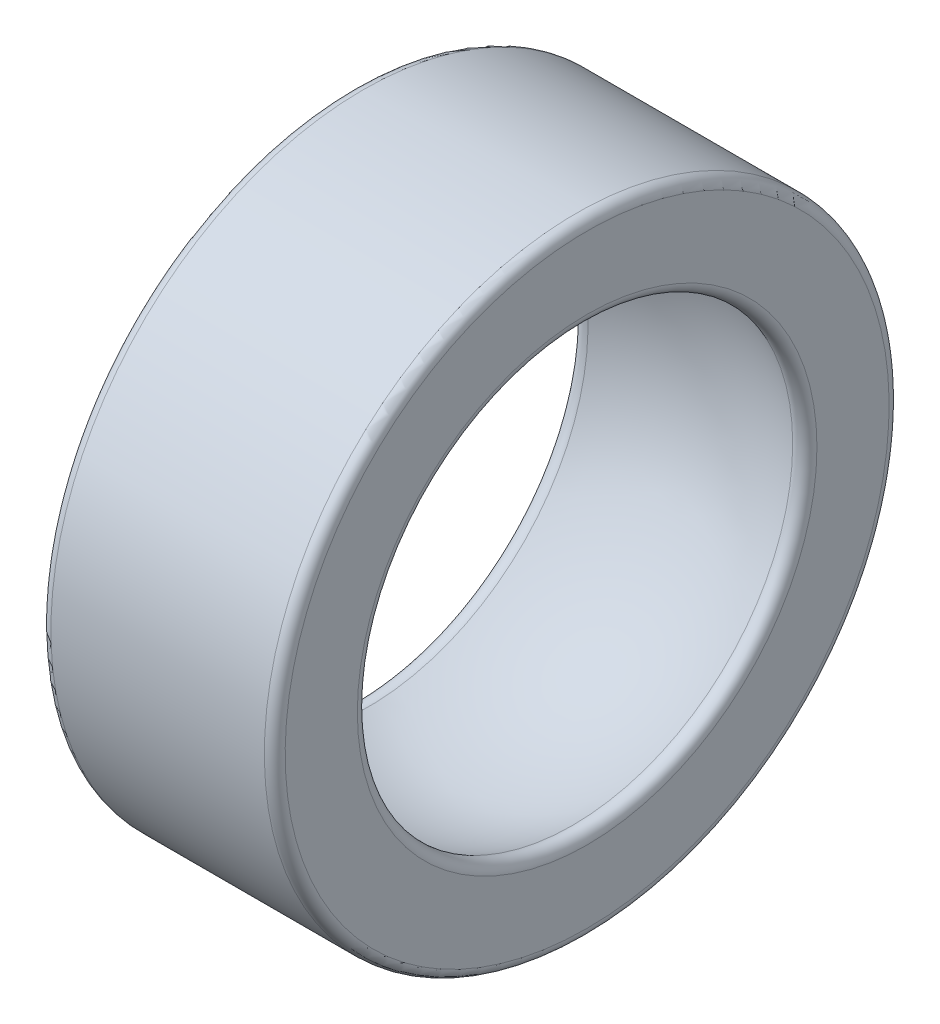
ISO-10303-21;
HEADER;
FILE_DESCRIPTION(('STEP AP214'),'2;1');
FILE_NAME('part.step','',(''),(''),'','','');
FILE_SCHEMA(('AUTOMOTIVE_DESIGN { 1 0 10303 214 1 1 1 1 }'));
ENDSEC;
DATA;
#1=APPLICATION_CONTEXT('core data for automotive mechanical design processes');
#2=APPLICATION_PROTOCOL_DEFINITION('international standard','automotive_design',2000,#1);
#3=PRODUCT_CONTEXT('',#1,'mechanical');
#4=PRODUCT('Part','Part','',(#3));
#5=PRODUCT_RELATED_PRODUCT_CATEGORY('part','',(#4));
#6=PRODUCT_DEFINITION_FORMATION('','',#4);
#7=PRODUCT_DEFINITION_CONTEXT('part definition',#1,'design');
#8=PRODUCT_DEFINITION('design','',#6,#7);
#9=PRODUCT_DEFINITION_SHAPE('','',#8);
#10=(LENGTH_UNIT() NAMED_UNIT(*) SI_UNIT(.MILLI.,.METRE.));
#11=(NAMED_UNIT(*) PLANE_ANGLE_UNIT() SI_UNIT($,.RADIAN.));
#12=(NAMED_UNIT(*) SI_UNIT($,.STERADIAN.) SOLID_ANGLE_UNIT());
#13=UNCERTAINTY_MEASURE_WITH_UNIT(LENGTH_MEASURE(1.E-05),#10,'distance_accuracy_value','');
#14=(GEOMETRIC_REPRESENTATION_CONTEXT(3) GLOBAL_UNCERTAINTY_ASSIGNED_CONTEXT((#13)) GLOBAL_UNIT_ASSIGNED_CONTEXT((#10,
#11,#12)) REPRESENTATION_CONTEXT('',''));
#15=CARTESIAN_POINT('',(0.,0.,0.));
#16=DIRECTION('',(0.,0.,1.));
#17=DIRECTION('',(1.,0.,0.));
#18=AXIS2_PLACEMENT_3D('',#15,#16,#17);
#19=CARTESIAN_POINT('',(3.375,6.13264828601804,0.));
#20=DIRECTION('',(-1.,0.,0.));
#21=DIRECTION('',(0.,-1.,0.));
#22=AXIS2_PLACEMENT_3D('',#19,#20,#21);
#23=PLANE('',#22);
#24=CARTESIAN_POINT('',(3.375,0.,0.));
#25=DIRECTION('',(-1.,0.,0.));
#26=DIRECTION('',(0.,-1.,0.));
#27=AXIS2_PLACEMENT_3D('',#24,#25,#26);
#28=CIRCLE('',#27,6.6207533559256);
#29=CARTESIAN_POINT('',(3.375,-6.6207533559256,0.));
#30=VERTEX_POINT('',#29);
#31=EDGE_CURVE('E44',#30,#30,#28,.T.);
#32=ORIENTED_EDGE('',*,*,#31,.T.);
#33=EDGE_LOOP('',(#32));
#34=FACE_BOUND('',#33,.T.);
#35=CARTESIAN_POINT('',(3.375,0.,0.));
#36=DIRECTION('',(-1.,0.,0.));
#37=DIRECTION('',(0.,-1.,0.));
#38=AXIS2_PLACEMENT_3D('',#35,#36,#37);
#39=CIRCLE('',#38,8.7);
#40=CARTESIAN_POINT('',(3.375,-8.7,0.));
#41=VERTEX_POINT('',#40);
#42=EDGE_CURVE('E48',#41,#41,#39,.F.);
#43=ORIENTED_EDGE('',*,*,#42,.T.);
#44=EDGE_LOOP('',(#43));
#45=FACE_BOUND('',#44,.T.);
#46=ADVANCED_FACE('F33',(#34,#45),#23,.F.);
#47=CARTESIAN_POINT('',(-8.35357055119223,0.,0.));
#48=DIRECTION('',(-1.,0.,0.));
#49=DIRECTION('',(0.,-1.,0.));
#50=AXIS2_PLACEMENT_3D('',#47,#48,#49);
#51=CYLINDRICAL_SURFACE('',#50,9.);
#52=CARTESIAN_POINT('',(3.075,0.,0.));
#53=DIRECTION('',(-1.,0.,0.));
#54=DIRECTION('',(0.,-1.,0.));
#55=AXIS2_PLACEMENT_3D('',#52,#53,#54);
#56=CIRCLE('',#55,9.);
#57=CARTESIAN_POINT('',(3.075,-9.,0.));
#58=VERTEX_POINT('',#57);
#59=EDGE_CURVE('E10',#58,#58,#56,.T.);
#60=ORIENTED_EDGE('',*,*,#59,.T.);
#61=EDGE_LOOP('',(#60));
#62=FACE_BOUND('',#61,.T.);
#63=CARTESIAN_POINT('',(-3.075,0.,0.));
#64=DIRECTION('',(1.,0.,0.));
#65=DIRECTION('',(0.,1.,0.));
#66=AXIS2_PLACEMENT_3D('',#63,#64,#65);
#67=CIRCLE('',#66,9.);
#68=CARTESIAN_POINT('',(-3.075,9.,0.));
#69=VERTEX_POINT('',#68);
#70=EDGE_CURVE('E40',#69,#69,#67,.T.);
#71=ORIENTED_EDGE('',*,*,#70,.T.);
#72=EDGE_LOOP('',(#71));
#73=FACE_BOUND('',#72,.T.);
#74=ADVANCED_FACE('F78',(#62,#73),#51,.T.);
#75=CARTESIAN_POINT('',(-3.375,6.13264828601804,0.));
#76=DIRECTION('',(1.,0.,0.));
#77=DIRECTION('',(0.,1.,0.));
#78=AXIS2_PLACEMENT_3D('',#75,#76,#77);
#79=PLANE('',#78);
#80=CARTESIAN_POINT('',(-3.375,0.,0.));
#81=DIRECTION('',(1.,0.,0.));
#82=DIRECTION('',(0.,1.,0.));
#83=AXIS2_PLACEMENT_3D('',#80,#81,#82);
#84=CIRCLE('',#83,6.62075335592559);
#85=CARTESIAN_POINT('',(-3.375,6.62075335592559,0.));
#86=VERTEX_POINT('',#85);
#87=EDGE_CURVE('E53',#86,#86,#84,.T.);
#88=ORIENTED_EDGE('',*,*,#87,.T.);
#89=EDGE_LOOP('',(#88));
#90=FACE_BOUND('',#89,.T.);
#91=CARTESIAN_POINT('',(-3.375,0.,0.));
#92=DIRECTION('',(1.,0.,0.));
#93=DIRECTION('',(0.,1.,0.));
#94=AXIS2_PLACEMENT_3D('',#91,#92,#93);
#95=CIRCLE('',#94,8.7);
#96=CARTESIAN_POINT('',(-3.375,8.7,0.));
#97=VERTEX_POINT('',#96);
#98=EDGE_CURVE('E56',#97,#97,#95,.F.);
#99=ORIENTED_EDGE('',*,*,#98,.T.);
#100=EDGE_LOOP('',(#99));
#101=FACE_BOUND('',#100,.T.);
#102=ADVANCED_FACE('F94',(#90,#101),#79,.F.);
#103=CARTESIAN_POINT('',(0.,0.,0.));
#104=DIRECTION('',(-1.,0.,0.));
#105=DIRECTION('',(0.,1.,0.));
#106=AXIS2_PLACEMENT_3D('',#103,#104,#105);
#107=SPHERICAL_SURFACE('',#106,7.);
#108=CARTESIAN_POINT('',(-2.9486301369863,0.,0.));
#109=DIRECTION('',(1.,0.,0.));
#110=DIRECTION('',(0.,1.,0.));
#111=AXIS2_PLACEMENT_3D('',#108,#109,#110);
#112=CIRCLE('',#111,6.34866760157249);
#113=CARTESIAN_POINT('',(-2.9486301369863,6.34866760157249,0.));
#114=VERTEX_POINT('',#113);
#115=EDGE_CURVE('E59',#114,#114,#112,.F.);
#116=CARTESIAN_POINT('',(2.9486301369863,0.,0.));
#117=DIRECTION('',(-1.,0.,0.));
#118=DIRECTION('',(0.,-1.,0.));
#119=AXIS2_PLACEMENT_3D('',#116,#117,#118);
#120=CIRCLE('',#119,6.34866760157249);
#121=CARTESIAN_POINT('',(2.9486301369863,6.34866760157249,0.));
#122=VERTEX_POINT('',#121);
#123=EDGE_CURVE('E62',#122,#122,#120,.F.);
#124=CARTESIAN_POINT('',(-2.9486301369863,6.34866760157249,0.));
#125=CARTESIAN_POINT('',(-2.89112131779377,6.37537774721778,0.));
#126=CARTESIAN_POINT('',(-2.83324939456579,6.40130607147659,0.));
#127=CARTESIAN_POINT('',(-2.71682247335963,6.45158085173497,0.));
#128=CARTESIAN_POINT('',(-2.65826747538146,6.47592730773454,0.));
#129=CARTESIAN_POINT('',(-2.54051753799562,6.52302012598816,0.));
#130=CARTESIAN_POINT('',(-2.48132259858796,6.54576648824221,0.));
#131=CARTESIAN_POINT('',(-2.36233651938632,6.58964238810665,0.));
#132=CARTESIAN_POINT('',(-2.30254537959235,6.61077192571704,0.));
#133=CARTESIAN_POINT('',(-2.18241104470974,6.6513985554716,0.));
#134=CARTESIAN_POINT('',(-2.1220678496211,6.67089564761578,0.));
#135=CARTESIAN_POINT('',(-2.00087396660975,6.70824299356644,0.));
#136=CARTESIAN_POINT('',(-1.94002327868704,6.72609324737294,0.));
#137=CARTESIAN_POINT('',(-1.81785934462588,6.76013373386251,0.));
#138=CARTESIAN_POINT('',(-1.75654609848742,6.77632396654558,0.));
#139=CARTESIAN_POINT('',(-1.63350232488574,6.80703245545798,0.));
#140=CARTESIAN_POINT('',(-1.57177179742252,6.8215507116873,0.));
#141=CARTESIAN_POINT('',(-1.44793904601683,6.84890452659994,0.));
#142=CARTESIAN_POINT('',(-1.38583682207438,6.86174008528325,0.));
#143=CARTESIAN_POINT('',(-1.26130653708491,6.88571902671483,0.));
#144=CARTESIAN_POINT('',(-1.1988784760379,6.89686240946309,0.));
#145=CARTESIAN_POINT('',(-1.0737426168149,6.91744877019117,0.));
#146=CARTESIAN_POINT('',(-1.01103481863891,6.92689174817098,0.));
#147=CARTESIAN_POINT('',(-0.885385791708884,6.94407032620036,0.));
#148=CARTESIAN_POINT('',(-0.822444562954847,6.95180592624992,0.));
#149=CARTESIAN_POINT('',(-0.696375153795426,6.96556403606734,0.));
#150=CARTESIAN_POINT('',(-0.633246973390042,6.9715865458352,0.));
#151=CARTESIAN_POINT('',(-0.50685027790926,6.98191402776925,0.));
#152=CARTESIAN_POINT('',(-0.443581762833862,6.98621899993545,0.));
#153=CARTESIAN_POINT('',(-0.316951118624402,6.99310822766105,0.));
#154=CARTESIAN_POINT('',(-0.25358898949034,6.99569248322046,0.));
#155=CARTESIAN_POINT('',(-0.126817906904185,6.99913836938993,0.));
#156=CARTESIAN_POINT('',(-0.0634089534520932,7.,0.));
#157=CARTESIAN_POINT('',(0.0634089534520912,7.,0.));
#158=CARTESIAN_POINT('',(0.126817906904183,6.99913836938993,0.));
#159=CARTESIAN_POINT('',(0.253588989490338,6.99569248322046,0.));
#160=CARTESIAN_POINT('',(0.3169511186244,6.99310822766105,0.));
#161=CARTESIAN_POINT('',(0.44358176283386,6.98621899993545,0.));
#162=CARTESIAN_POINT('',(0.506850277909258,6.98191402776926,0.));
#163=CARTESIAN_POINT('',(0.63324697339004,6.9715865458352,0.));
#164=CARTESIAN_POINT('',(0.696375153795424,6.96556403606734,0.));
#165=CARTESIAN_POINT('',(0.822444562954845,6.95180592624992,0.));
#166=CARTESIAN_POINT('',(0.885385791708882,6.94407032620036,0.));
#167=CARTESIAN_POINT('',(1.01103481863891,6.92689174817098,0.));
#168=CARTESIAN_POINT('',(1.0737426168149,6.91744877019117,0.));
#169=CARTESIAN_POINT('',(1.1988784760379,6.89686240946309,0.));
#170=CARTESIAN_POINT('',(1.26130653708491,6.88571902671483,0.));
#171=CARTESIAN_POINT('',(1.38583682207437,6.86174008528325,0.));
#172=CARTESIAN_POINT('',(1.44793904601683,6.84890452659994,0.));
#173=CARTESIAN_POINT('',(1.57177179742251,6.8215507116873,0.));
#174=CARTESIAN_POINT('',(1.63350232488574,6.80703245545798,0.));
#175=CARTESIAN_POINT('',(1.75654609848742,6.77632396654558,0.));
#176=CARTESIAN_POINT('',(1.81785934462587,6.76013373386251,0.));
#177=CARTESIAN_POINT('',(1.94002327868704,6.72609324737294,0.));
#178=CARTESIAN_POINT('',(2.00087396660975,6.70824299356644,0.));
#179=CARTESIAN_POINT('',(2.1220678496211,6.67089564761578,0.));
#180=CARTESIAN_POINT('',(2.18241104470973,6.6513985554716,0.));
#181=CARTESIAN_POINT('',(2.30254537959235,6.61077192571704,0.));
#182=CARTESIAN_POINT('',(2.36233651938632,6.58964238810666,0.));
#183=CARTESIAN_POINT('',(2.48132259858796,6.54576648824221,0.));
#184=CARTESIAN_POINT('',(2.54051753799562,6.52302012598816,0.));
#185=CARTESIAN_POINT('',(2.65826747538146,6.47592730773454,0.));
#186=CARTESIAN_POINT('',(2.71682247335963,6.45158085173497,0.));
#187=CARTESIAN_POINT('',(2.83324939456579,6.40130607147659,0.));
#188=CARTESIAN_POINT('',(2.89112131779377,6.37537774721778,0.));
#189=CARTESIAN_POINT('',(2.9486301369863,6.34866760157249,0.));
#190=B_SPLINE_CURVE_WITH_KNOTS('',3,(#124,#125,#126,#127,#128,#129,#130,#131,#132,#133,#134,
#135,#136,#137,#138,#139,#140,#141,#142,#143,#144,#145,#146,#147,#148,#149,#150,#151,#152,#153,
#154,#155,#156,#157,#158,#159,#160,#161,#162,#163,#164,#165,#166,#167,#168,#169,#170,#171,#172,
#173,#174,#175,#176,#177,#178,#179,#180,#181,#182,#183,#184,#185,#186,#187,#188,#189),
.UNSPECIFIED.,.F.,.F.,(4,2,2,2,2,2,2,2,2,2,2,2,2,2,2,2,2,2,2,2,2,2,2,2,2,2,2,2,2,2,2,2,4),(0.,
0.190221007586734,0.380442015173468,0.570663022760202,0.760884030346935,0.95110503793367,
1.1413260455204,1.33154705310714,1.52176806069387,1.7119890682806,1.90221007586734,
2.09243108345407,2.28265209104081,2.47287309862754,2.66309410621427,2.85331511380101,
3.04353612138774,3.23375712897447,3.42397813656121,3.61419914414794,3.80442015173468,
3.99464115932141,4.18486216690814,4.37508317449488,4.56530418208161,4.75552518966834,
4.94574619725508,5.13596720484181,5.32618821242855,5.51640922001528,5.70663022760201,
5.89685123518875,6.08707224277548),.UNSPECIFIED.);
#191=EDGE_CURVE('BSEAM66',#114,#122,#190,.T.);
#192=ORIENTED_EDGE('',*,*,#115,.T.);
#193=ORIENTED_EDGE('',*,*,#123,.T.);
#194=ORIENTED_EDGE('',*,*,#191,.T.);
#195=ORIENTED_EDGE('',*,*,#191,.F.);
#196=EDGE_LOOP('',(#192,#194,#193,#195));
#197=FACE_BOUND('',#196,.T.);
#198=ADVANCED_FACE('F66',(#197),#107,.F.);
#199=CARTESIAN_POINT('',(-3.075,0.,0.));
#200=DIRECTION('',(1.,0.,0.));
#201=DIRECTION('',(0.,1.,0.));
#202=AXIS2_PLACEMENT_3D('',#199,#200,#201);
#203=TOROIDAL_SURFACE('',#202,6.62075335592559,0.3);
#204=ORIENTED_EDGE('',*,*,#87,.F.);
#205=EDGE_LOOP('',(#204));
#206=FACE_BOUND('',#205,.T.);
#207=ORIENTED_EDGE('',*,*,#115,.F.);
#208=EDGE_LOOP('',(#207));
#209=FACE_BOUND('',#208,.T.);
#210=ADVANCED_FACE('F72',(#206,#209),#203,.T.);
#211=CARTESIAN_POINT('',(3.075,0.,0.));
#212=DIRECTION('',(-1.,0.,0.));
#213=DIRECTION('',(0.,-1.,0.));
#214=AXIS2_PLACEMENT_3D('',#211,#212,#213);
#215=TOROIDAL_SURFACE('',#214,6.6207533559256,0.3);
#216=ORIENTED_EDGE('',*,*,#123,.F.);
#217=EDGE_LOOP('',(#216));
#218=FACE_BOUND('',#217,.T.);
#219=ORIENTED_EDGE('',*,*,#31,.F.);
#220=EDGE_LOOP('',(#219));
#221=FACE_BOUND('',#220,.T.);
#222=ADVANCED_FACE('F68',(#218,#221),#215,.T.);
#223=CARTESIAN_POINT('',(3.075,0.,0.));
#224=DIRECTION('',(-1.,0.,0.));
#225=DIRECTION('',(0.,-1.,0.));
#226=AXIS2_PLACEMENT_3D('',#223,#224,#225);
#227=TOROIDAL_SURFACE('',#226,8.7,0.3);
#228=ORIENTED_EDGE('',*,*,#42,.F.);
#229=EDGE_LOOP('',(#228));
#230=FACE_BOUND('',#229,.T.);
#231=ORIENTED_EDGE('',*,*,#59,.F.);
#232=EDGE_LOOP('',(#231));
#233=FACE_BOUND('',#232,.T.);
#234=ADVANCED_FACE('F71',(#230,#233),#227,.T.);
#235=CARTESIAN_POINT('',(-3.075,0.,0.));
#236=DIRECTION('',(1.,0.,0.));
#237=DIRECTION('',(0.,1.,0.));
#238=AXIS2_PLACEMENT_3D('',#235,#236,#237);
#239=TOROIDAL_SURFACE('',#238,8.7,0.3);
#240=ORIENTED_EDGE('',*,*,#70,.F.);
#241=EDGE_LOOP('',(#240));
#242=FACE_BOUND('',#241,.T.);
#243=ORIENTED_EDGE('',*,*,#98,.F.);
#244=EDGE_LOOP('',(#243));
#245=FACE_BOUND('',#244,.T.);
#246=ADVANCED_FACE('F35',(#242,#245),#239,.T.);
#247=CLOSED_SHELL('',(#46,#74,#102,#198,#210,#222,#234,#246));
#248=MANIFOLD_SOLID_BREP('B2',#247);
#249=ADVANCED_BREP_SHAPE_REPRESENTATION('',(#18,#248),#14);
#250=SHAPE_DEFINITION_REPRESENTATION(#9,#249);
ENDSEC;
END-ISO-10303-21;
